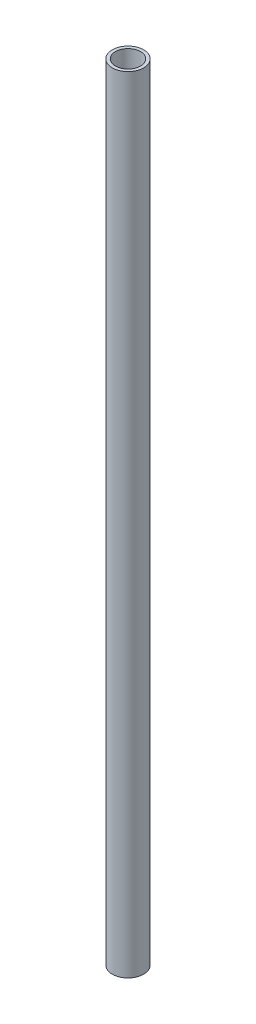
ISO-10303-21;
HEADER;
FILE_DESCRIPTION(('STEP AP214'),'2;1');
FILE_NAME('part.step','',(''),(''),'','','');
FILE_SCHEMA(('AUTOMOTIVE_DESIGN { 1 0 10303 214 1 1 1 1 }'));
ENDSEC;
DATA;
#1=APPLICATION_CONTEXT('core data for automotive mechanical design processes');
#2=APPLICATION_PROTOCOL_DEFINITION('international standard','automotive_design',2000,#1);
#3=PRODUCT_CONTEXT('',#1,'mechanical');
#4=PRODUCT('Part','Part','',(#3));
#5=PRODUCT_RELATED_PRODUCT_CATEGORY('part','',(#4));
#6=PRODUCT_DEFINITION_FORMATION('','',#4);
#7=PRODUCT_DEFINITION_CONTEXT('part definition',#1,'design');
#8=PRODUCT_DEFINITION('design','',#6,#7);
#9=PRODUCT_DEFINITION_SHAPE('','',#8);
#10=(LENGTH_UNIT() NAMED_UNIT(*) SI_UNIT(.MILLI.,.METRE.));
#11=(NAMED_UNIT(*) PLANE_ANGLE_UNIT() SI_UNIT($,.RADIAN.));
#12=(NAMED_UNIT(*) SI_UNIT($,.STERADIAN.) SOLID_ANGLE_UNIT());
#13=UNCERTAINTY_MEASURE_WITH_UNIT(LENGTH_MEASURE(1.E-05),#10,'distance_accuracy_value','');
#14=(GEOMETRIC_REPRESENTATION_CONTEXT(3) GLOBAL_UNCERTAINTY_ASSIGNED_CONTEXT((#13)) GLOBAL_UNIT_ASSIGNED_CONTEXT((#10,
#11,#12)) REPRESENTATION_CONTEXT('',''));
#15=CARTESIAN_POINT('',(0.,0.,0.));
#16=DIRECTION('',(0.,0.,1.));
#17=DIRECTION('',(1.,0.,0.));
#18=AXIS2_PLACEMENT_3D('',#15,#16,#17);
#19=CARTESIAN_POINT('',(0.,125.,0.));
#20=DIRECTION('',(0.,1.,0.));
#21=DIRECTION('',(0.,0.,1.));
#22=AXIS2_PLACEMENT_3D('',#19,#20,#21);
#23=PLANE('',#22);
#24=CARTESIAN_POINT('',(0.,125.,0.));
#25=DIRECTION('',(0.,1.,0.));
#26=DIRECTION('',(0.,0.,1.));
#27=AXIS2_PLACEMENT_3D('',#24,#25,#26);
#28=CIRCLE('',#27,5.);
#29=CARTESIAN_POINT('',(0.,125.,5.));
#30=VERTEX_POINT('',#29);
#31=EDGE_CURVE('E10',#30,#30,#28,.T.);
#32=ORIENTED_EDGE('',*,*,#31,.T.);
#33=EDGE_LOOP('',(#32));
#34=FACE_BOUND('',#33,.T.);
#35=CARTESIAN_POINT('',(0.,125.,0.));
#36=DIRECTION('',(0.,1.,0.));
#37=DIRECTION('',(0.,0.,1.));
#38=AXIS2_PLACEMENT_3D('',#35,#36,#37);
#39=CIRCLE('',#38,4.);
#40=CARTESIAN_POINT('',(0.,125.,4.));
#41=VERTEX_POINT('',#40);
#42=EDGE_CURVE('E46',#41,#41,#39,.T.);
#43=ORIENTED_EDGE('',*,*,#42,.F.);
#44=EDGE_LOOP('',(#43));
#45=FACE_BOUND('',#44,.T.);
#46=ADVANCED_FACE('F35',(#34,#45),#23,.T.);
#47=CARTESIAN_POINT('',(0.,-125.,0.));
#48=DIRECTION('',(0.,1.,0.));
#49=DIRECTION('',(0.,0.,1.));
#50=AXIS2_PLACEMENT_3D('',#47,#48,#49);
#51=PLANE('',#50);
#52=CARTESIAN_POINT('',(0.,-125.,0.));
#53=DIRECTION('',(0.,1.,0.));
#54=DIRECTION('',(0.,0.,1.));
#55=AXIS2_PLACEMENT_3D('',#52,#53,#54);
#56=CIRCLE('',#55,5.);
#57=CARTESIAN_POINT('',(0.,-125.,5.));
#58=VERTEX_POINT('',#57);
#59=EDGE_CURVE('E39',#58,#58,#56,.T.);
#60=ORIENTED_EDGE('',*,*,#59,.F.);
#61=EDGE_LOOP('',(#60));
#62=FACE_BOUND('',#61,.T.);
#63=CARTESIAN_POINT('',(0.,-125.,0.));
#64=DIRECTION('',(0.,1.,0.));
#65=DIRECTION('',(0.,0.,1.));
#66=AXIS2_PLACEMENT_3D('',#63,#64,#65);
#67=CIRCLE('',#66,4.);
#68=CARTESIAN_POINT('',(0.,-125.,4.));
#69=VERTEX_POINT('',#68);
#70=EDGE_CURVE('E48',#69,#69,#67,.T.);
#71=ORIENTED_EDGE('',*,*,#70,.T.);
#72=EDGE_LOOP('',(#71));
#73=FACE_BOUND('',#72,.T.);
#74=ADVANCED_FACE('F58',(#62,#73),#51,.F.);
#75=CARTESIAN_POINT('',(0.,125.,0.));
#76=DIRECTION('',(0.,-1.,0.));
#77=DIRECTION('',(0.,0.,-1.));
#78=AXIS2_PLACEMENT_3D('',#75,#76,#77);
#79=CYLINDRICAL_SURFACE('',#78,5.);
#80=ORIENTED_EDGE('',*,*,#31,.F.);
#81=EDGE_LOOP('',(#80));
#82=FACE_BOUND('',#81,.T.);
#83=ORIENTED_EDGE('',*,*,#59,.T.);
#84=EDGE_LOOP('',(#83));
#85=FACE_BOUND('',#84,.T.);
#86=ADVANCED_FACE('F37',(#82,#85),#79,.T.);
#87=CARTESIAN_POINT('',(0.,125.,0.));
#88=DIRECTION('',(0.,-1.,0.));
#89=DIRECTION('',(0.,0.,-1.));
#90=AXIS2_PLACEMENT_3D('',#87,#88,#89);
#91=CYLINDRICAL_SURFACE('',#90,4.);
#92=ORIENTED_EDGE('',*,*,#42,.T.);
#93=EDGE_LOOP('',(#92));
#94=FACE_BOUND('',#93,.T.);
#95=ORIENTED_EDGE('',*,*,#70,.F.);
#96=EDGE_LOOP('',(#95));
#97=FACE_BOUND('',#96,.T.);
#98=ADVANCED_FACE('F54',(#94,#97),#91,.F.);
#99=CLOSED_SHELL('',(#46,#74,#86,#98));
#100=MANIFOLD_SOLID_BREP('B2',#99);
#101=ADVANCED_BREP_SHAPE_REPRESENTATION('',(#18,#100),#14);
#102=SHAPE_DEFINITION_REPRESENTATION(#9,#101);
ENDSEC;
END-ISO-10303-21;
